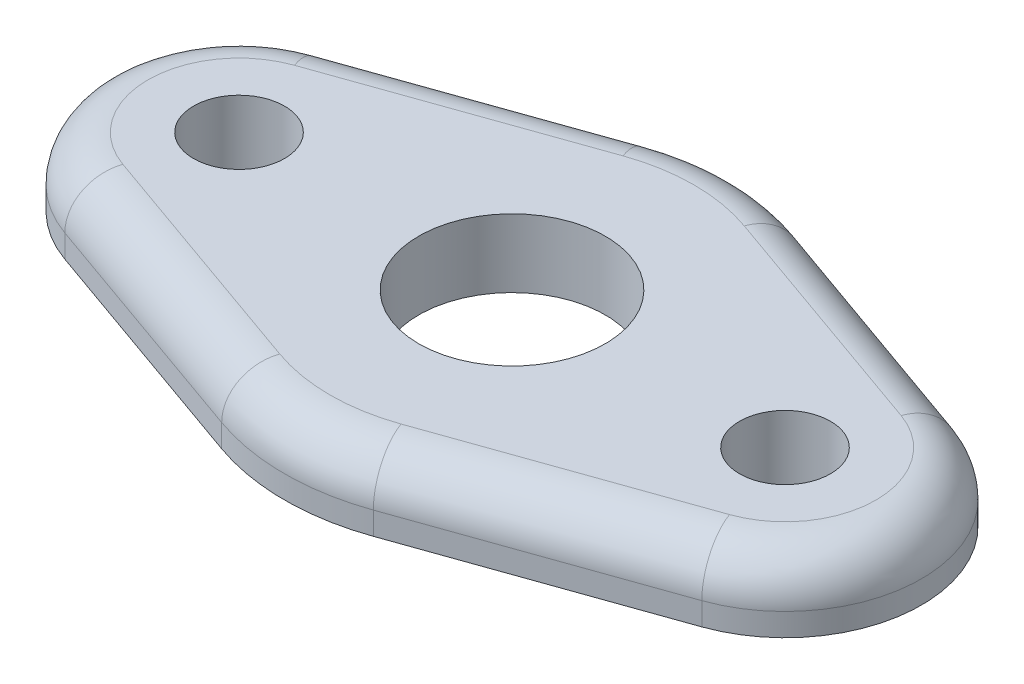
ISO-10303-21;
HEADER;
FILE_DESCRIPTION(('STEP AP214'),'2;1');
FILE_NAME('part.step','',(''),(''),'','','');
FILE_SCHEMA(('AUTOMOTIVE_DESIGN { 1 0 10303 214 1 1 1 1 }'));
ENDSEC;
DATA;
#1=APPLICATION_CONTEXT('core data for automotive mechanical design processes');
#2=APPLICATION_PROTOCOL_DEFINITION('international standard','automotive_design',2000,#1);
#3=PRODUCT_CONTEXT('',#1,'mechanical');
#4=PRODUCT('Part','Part','',(#3));
#5=PRODUCT_RELATED_PRODUCT_CATEGORY('part','',(#4));
#6=PRODUCT_DEFINITION_FORMATION('','',#4);
#7=PRODUCT_DEFINITION_CONTEXT('part definition',#1,'design');
#8=PRODUCT_DEFINITION('design','',#6,#7);
#9=PRODUCT_DEFINITION_SHAPE('','',#8);
#10=(LENGTH_UNIT() NAMED_UNIT(*) SI_UNIT(.MILLI.,.METRE.));
#11=(NAMED_UNIT(*) PLANE_ANGLE_UNIT() SI_UNIT($,.RADIAN.));
#12=(NAMED_UNIT(*) SI_UNIT($,.STERADIAN.) SOLID_ANGLE_UNIT());
#13=UNCERTAINTY_MEASURE_WITH_UNIT(LENGTH_MEASURE(1.E-05),#10,'distance_accuracy_value','');
#14=(GEOMETRIC_REPRESENTATION_CONTEXT(3) GLOBAL_UNCERTAINTY_ASSIGNED_CONTEXT((#13)) GLOBAL_UNIT_ASSIGNED_CONTEXT((#10,
#11,#12)) REPRESENTATION_CONTEXT('',''));
#15=CARTESIAN_POINT('',(0.,0.,0.));
#16=DIRECTION('',(0.,0.,1.));
#17=DIRECTION('',(1.,0.,0.));
#18=AXIS2_PLACEMENT_3D('',#15,#16,#17);
#19=CARTESIAN_POINT('',(-12.,3.,0.));
#20=DIRECTION('',(0.,1.,0.));
#21=DIRECTION('',(0.,0.,1.));
#22=AXIS2_PLACEMENT_3D('',#19,#20,#21);
#23=PLANE('',#22);
#24=DIRECTION('',(0.942809041582064,0.,0.333333333333333));
#25=VECTOR('',#24,1.);
#26=CARTESIAN_POINT('',(-2.66666666666666,3.,7.54247233265651));
#27=LINE('',#26,#25);
#28=CARTESIAN_POINT('',(-13.3333333333333,3.,3.77123616632826));
#29=VERTEX_POINT('',#28);
#30=CARTESIAN_POINT('',(-2.66666666666667,3.,7.54247233265651));
#31=VERTEX_POINT('',#30);
#32=EDGE_CURVE('E196',#29,#31,#27,.T.);
#33=ORIENTED_EDGE('',*,*,#32,.T.);
#34=CARTESIAN_POINT('',(0.,3.,0.));
#35=DIRECTION('',(0.,1.,0.));
#36=DIRECTION('',(0.,0.,1.));
#37=AXIS2_PLACEMENT_3D('',#34,#35,#36);
#38=CIRCLE('',#37,8.);
#39=CARTESIAN_POINT('',(2.66666666666667,3.,7.54247233265651));
#40=VERTEX_POINT('',#39);
#41=EDGE_CURVE('E198',#31,#40,#38,.T.);
#42=ORIENTED_EDGE('',*,*,#41,.T.);
#43=DIRECTION('',(0.942809041582063,0.,-0.333333333333333));
#44=VECTOR('',#43,1.);
#45=CARTESIAN_POINT('',(13.3333333333333,3.,3.77123616632826));
#46=LINE('',#45,#44);
#47=CARTESIAN_POINT('',(13.3333333333333,3.,3.77123616632826));
#48=VERTEX_POINT('',#47);
#49=EDGE_CURVE('E134',#40,#48,#46,.T.);
#50=ORIENTED_EDGE('',*,*,#49,.T.);
#51=CARTESIAN_POINT('',(12.,3.,0.));
#52=DIRECTION('',(0.,1.,0.));
#53=DIRECTION('',(0.,0.,1.));
#54=AXIS2_PLACEMENT_3D('',#51,#52,#53);
#55=CIRCLE('',#54,4.);
#56=CARTESIAN_POINT('',(13.3333333333333,3.,-3.77123616632826));
#57=VERTEX_POINT('',#56);
#58=EDGE_CURVE('E186',#48,#57,#55,.T.);
#59=ORIENTED_EDGE('',*,*,#58,.T.);
#60=DIRECTION('',(-0.942809041582063,0.,-0.333333333333333));
#61=VECTOR('',#60,1.);
#62=CARTESIAN_POINT('',(2.66666666666666,3.,-7.54247233265651));
#63=LINE('',#62,#61);
#64=CARTESIAN_POINT('',(2.66666666666666,3.,-7.54247233265651));
#65=VERTEX_POINT('',#64);
#66=EDGE_CURVE('E188',#57,#65,#63,.T.);
#67=ORIENTED_EDGE('',*,*,#66,.T.);
#68=CARTESIAN_POINT('',(0.,3.,0.));
#69=DIRECTION('',(0.,1.,0.));
#70=DIRECTION('',(0.,0.,1.));
#71=AXIS2_PLACEMENT_3D('',#68,#69,#70);
#72=CIRCLE('',#71,8.);
#73=CARTESIAN_POINT('',(-2.66666666666667,3.,-7.54247233265651));
#74=VERTEX_POINT('',#73);
#75=EDGE_CURVE('E190',#65,#74,#72,.T.);
#76=ORIENTED_EDGE('',*,*,#75,.T.);
#77=DIRECTION('',(-0.942809041582064,0.,0.333333333333333));
#78=VECTOR('',#77,1.);
#79=CARTESIAN_POINT('',(-13.3333333333333,3.,-3.77123616632826));
#80=LINE('',#79,#78);
#81=CARTESIAN_POINT('',(-13.3333333333333,3.,-3.77123616632826));
#82=VERTEX_POINT('',#81);
#83=EDGE_CURVE('E192',#74,#82,#80,.T.);
#84=ORIENTED_EDGE('',*,*,#83,.T.);
#85=CARTESIAN_POINT('',(-12.,3.,0.));
#86=DIRECTION('',(0.,1.,0.));
#87=DIRECTION('',(0.,0.,1.));
#88=AXIS2_PLACEMENT_3D('',#85,#86,#87);
#89=CIRCLE('',#88,4.);
#90=EDGE_CURVE('E194',#82,#29,#89,.T.);
#91=ORIENTED_EDGE('',*,*,#90,.T.);
#92=EDGE_LOOP('',(#33,#42,#50,#59,#67,#76,#84,#91));
#93=FACE_BOUND('',#92,.T.);
#94=CARTESIAN_POINT('',(-12.,3.,0.));
#95=DIRECTION('',(0.,1.,0.));
#96=DIRECTION('',(0.,0.,1.));
#97=AXIS2_PLACEMENT_3D('',#94,#95,#96);
#98=CIRCLE('',#97,2.);
#99=CARTESIAN_POINT('',(-12.,3.,2.));
#100=VERTEX_POINT('',#99);
#101=EDGE_CURVE('E248',#100,#100,#98,.T.);
#102=ORIENTED_EDGE('',*,*,#101,.F.);
#103=EDGE_LOOP('',(#102));
#104=FACE_BOUND('',#103,.T.);
#105=CARTESIAN_POINT('',(0.,3.,0.));
#106=DIRECTION('',(0.,1.,0.));
#107=DIRECTION('',(0.,0.,1.));
#108=AXIS2_PLACEMENT_3D('',#105,#106,#107);
#109=CIRCLE('',#108,4.1);
#110=CARTESIAN_POINT('',(0.,3.,4.1));
#111=VERTEX_POINT('',#110);
#112=EDGE_CURVE('E151',#111,#111,#109,.T.);
#113=ORIENTED_EDGE('',*,*,#112,.F.);
#114=EDGE_LOOP('',(#113));
#115=FACE_BOUND('',#114,.T.);
#116=CARTESIAN_POINT('',(12.,3.,0.));
#117=DIRECTION('',(0.,1.,0.));
#118=DIRECTION('',(0.,0.,1.));
#119=AXIS2_PLACEMENT_3D('',#116,#117,#118);
#120=CIRCLE('',#119,2.);
#121=CARTESIAN_POINT('',(12.,3.,2.));
#122=VERTEX_POINT('',#121);
#123=EDGE_CURVE('E240',#122,#122,#120,.T.);
#124=ORIENTED_EDGE('',*,*,#123,.F.);
#125=EDGE_LOOP('',(#124));
#126=FACE_BOUND('',#125,.T.);
#127=ADVANCED_FACE('F33',(#93,#104,#115,#126),#23,.T.);
#128=CARTESIAN_POINT('',(-12.,0.,0.));
#129=DIRECTION('',(0.,1.,0.));
#130=DIRECTION('',(0.,0.,1.));
#131=AXIS2_PLACEMENT_3D('',#128,#129,#130);
#132=PLANE('',#131);
#133=CARTESIAN_POINT('',(-12.,0.,0.));
#134=DIRECTION('',(0.,1.,0.));
#135=DIRECTION('',(0.,0.,1.));
#136=AXIS2_PLACEMENT_3D('',#133,#134,#135);
#137=CIRCLE('',#136,6.);
#138=CARTESIAN_POINT('',(-14.,0.,-5.65685424949238));
#139=VERTEX_POINT('',#138);
#140=CARTESIAN_POINT('',(-14.,0.,5.65685424949238));
#141=VERTEX_POINT('',#140);
#142=EDGE_CURVE('E142',#139,#141,#137,.T.);
#143=ORIENTED_EDGE('',*,*,#142,.F.);
#144=DIRECTION('',(-0.942809041582064,0.,0.333333333333333));
#145=VECTOR('',#144,1.);
#146=CARTESIAN_POINT('',(-14.,0.,-5.65685424949238));
#147=LINE('',#146,#145);
#148=CARTESIAN_POINT('',(-3.33333333333333,0.,-9.42809041582063));
#149=VERTEX_POINT('',#148);
#150=EDGE_CURVE('E171',#149,#139,#147,.T.);
#151=ORIENTED_EDGE('',*,*,#150,.F.);
#152=CARTESIAN_POINT('',(0.,0.,0.));
#153=DIRECTION('',(0.,1.,0.));
#154=DIRECTION('',(0.,0.,1.));
#155=AXIS2_PLACEMENT_3D('',#152,#153,#154);
#156=CIRCLE('',#155,10.);
#157=CARTESIAN_POINT('',(3.33333333333333,0.,-9.42809041582064));
#158=VERTEX_POINT('',#157);
#159=EDGE_CURVE('E168',#158,#149,#156,.T.);
#160=ORIENTED_EDGE('',*,*,#159,.F.);
#161=DIRECTION('',(-0.942809041582063,0.,-0.333333333333333));
#162=VECTOR('',#161,1.);
#163=CARTESIAN_POINT('',(3.33333333333333,0.,-9.42809041582064));
#164=LINE('',#163,#162);
#165=CARTESIAN_POINT('',(14.,0.,-5.65685424949238));
#166=VERTEX_POINT('',#165);
#167=EDGE_CURVE('E165',#166,#158,#164,.T.);
#168=ORIENTED_EDGE('',*,*,#167,.F.);
#169=CARTESIAN_POINT('',(12.,0.,0.));
#170=DIRECTION('',(0.,1.,0.));
#171=DIRECTION('',(0.,0.,1.));
#172=AXIS2_PLACEMENT_3D('',#169,#170,#171);
#173=CIRCLE('',#172,6.);
#174=CARTESIAN_POINT('',(14.,0.,5.65685424949238));
#175=VERTEX_POINT('',#174);
#176=EDGE_CURVE('E162',#175,#166,#173,.T.);
#177=ORIENTED_EDGE('',*,*,#176,.F.);
#178=DIRECTION('',(0.942809041582063,0.,-0.333333333333333));
#179=VECTOR('',#178,1.);
#180=CARTESIAN_POINT('',(3.33333333333333,0.,9.42809041582064));
#181=LINE('',#180,#179);
#182=CARTESIAN_POINT('',(3.33333333333333,0.,9.42809041582064));
#183=VERTEX_POINT('',#182);
#184=EDGE_CURVE('E159',#183,#175,#181,.T.);
#185=ORIENTED_EDGE('',*,*,#184,.F.);
#186=CARTESIAN_POINT('',(0.,0.,0.));
#187=DIRECTION('',(0.,1.,0.));
#188=DIRECTION('',(0.,0.,1.));
#189=AXIS2_PLACEMENT_3D('',#186,#187,#188);
#190=CIRCLE('',#189,10.);
#191=CARTESIAN_POINT('',(-3.33333333333333,0.,9.42809041582063));
#192=VERTEX_POINT('',#191);
#193=EDGE_CURVE('E145',#192,#183,#190,.T.);
#194=ORIENTED_EDGE('',*,*,#193,.F.);
#195=DIRECTION('',(0.942809041582064,0.,0.333333333333333));
#196=VECTOR('',#195,1.);
#197=CARTESIAN_POINT('',(-14.,0.,5.65685424949238));
#198=LINE('',#197,#196);
#199=EDGE_CURVE('E127',#141,#192,#198,.T.);
#200=ORIENTED_EDGE('',*,*,#199,.F.);
#201=EDGE_LOOP('',(#143,#151,#160,#168,#177,#185,#194,#200));
#202=FACE_BOUND('',#201,.T.);
#203=CARTESIAN_POINT('',(0.,0.,0.));
#204=DIRECTION('',(0.,1.,0.));
#205=DIRECTION('',(0.,0.,1.));
#206=AXIS2_PLACEMENT_3D('',#203,#204,#205);
#207=CIRCLE('',#206,4.1);
#208=CARTESIAN_POINT('',(0.,0.,4.1));
#209=VERTEX_POINT('',#208);
#210=EDGE_CURVE('E154',#209,#209,#207,.T.);
#211=ORIENTED_EDGE('',*,*,#210,.T.);
#212=EDGE_LOOP('',(#211));
#213=FACE_BOUND('',#212,.T.);
#214=CARTESIAN_POINT('',(-12.,0.,0.));
#215=DIRECTION('',(0.,1.,0.));
#216=DIRECTION('',(0.,0.,1.));
#217=AXIS2_PLACEMENT_3D('',#214,#215,#216);
#218=CIRCLE('',#217,2.);
#219=CARTESIAN_POINT('',(-12.,0.,2.));
#220=VERTEX_POINT('',#219);
#221=EDGE_CURVE('E245',#220,#220,#218,.T.);
#222=ORIENTED_EDGE('',*,*,#221,.T.);
#223=EDGE_LOOP('',(#222));
#224=FACE_BOUND('',#223,.T.);
#225=CARTESIAN_POINT('',(12.,0.,0.));
#226=DIRECTION('',(0.,1.,0.));
#227=DIRECTION('',(0.,0.,1.));
#228=AXIS2_PLACEMENT_3D('',#225,#226,#227);
#229=CIRCLE('',#228,2.);
#230=CARTESIAN_POINT('',(12.,0.,2.));
#231=VERTEX_POINT('',#230);
#232=EDGE_CURVE('E234',#231,#231,#229,.T.);
#233=ORIENTED_EDGE('',*,*,#232,.T.);
#234=EDGE_LOOP('',(#233));
#235=FACE_BOUND('',#234,.T.);
#236=ADVANCED_FACE('F139',(#202,#213,#224,#235),#132,.F.);
#237=CARTESIAN_POINT('',(-12.,3.,0.));
#238=DIRECTION('',(0.,-1.,0.));
#239=DIRECTION('',(0.,0.,-1.));
#240=AXIS2_PLACEMENT_3D('',#237,#238,#239);
#241=CYLINDRICAL_SURFACE('',#240,6.);
#242=DIRECTION('',(0.,-1.,0.));
#243=VECTOR('',#242,1.);
#244=CARTESIAN_POINT('',(-14.,3.,5.65685424949238));
#245=LINE('',#244,#243);
#246=CARTESIAN_POINT('',(-14.,1.,5.65685424949238));
#247=VERTEX_POINT('',#246);
#248=EDGE_CURVE('E123',#247,#141,#245,.T.);
#249=ORIENTED_EDGE('',*,*,#248,.F.);
#250=CARTESIAN_POINT('',(-12.,1.,0.));
#251=DIRECTION('',(0.,1.,0.));
#252=DIRECTION('',(0.,0.,1.));
#253=AXIS2_PLACEMENT_3D('',#250,#251,#252);
#254=CIRCLE('',#253,6.);
#255=CARTESIAN_POINT('',(-14.,1.,-5.65685424949238));
#256=VERTEX_POINT('',#255);
#257=EDGE_CURVE('E205',#247,#256,#254,.F.);
#258=ORIENTED_EDGE('',*,*,#257,.T.);
#259=DIRECTION('',(0.,-1.,0.));
#260=VECTOR('',#259,1.);
#261=CARTESIAN_POINT('',(-14.,3.,-5.65685424949238));
#262=LINE('',#261,#260);
#263=EDGE_CURVE('E149',#256,#139,#262,.T.);
#264=ORIENTED_EDGE('',*,*,#263,.T.);
#265=ORIENTED_EDGE('',*,*,#142,.T.);
#266=EDGE_LOOP('',(#249,#258,#264,#265));
#267=FACE_BOUND('',#266,.T.);
#268=ADVANCED_FACE('F147',(#267),#241,.T.);
#269=CARTESIAN_POINT('',(-14.,3.,5.65685424949238));
#270=DIRECTION('',(0.333333333333333,0.,-0.942809041582063));
#271=DIRECTION('',(-0.942809041582064,0.,-0.333333333333333));
#272=AXIS2_PLACEMENT_3D('',#269,#270,#271);
#273=PLANE('',#272);
#274=DIRECTION('',(0.,-1.,0.));
#275=VECTOR('',#274,1.);
#276=CARTESIAN_POINT('',(-3.33333333333333,3.,9.42809041582063));
#277=LINE('',#276,#275);
#278=CARTESIAN_POINT('',(-3.33333333333333,1.,9.42809041582063));
#279=VERTEX_POINT('',#278);
#280=EDGE_CURVE('E135',#279,#192,#277,.T.);
#281=ORIENTED_EDGE('',*,*,#280,.F.);
#282=DIRECTION('',(0.942809041582064,0.,0.333333333333333));
#283=VECTOR('',#282,1.);
#284=CARTESIAN_POINT('',(-14.,1.,5.65685424949238));
#285=LINE('',#284,#283);
#286=EDGE_CURVE('E130',#279,#247,#285,.F.);
#287=ORIENTED_EDGE('',*,*,#286,.T.);
#288=ORIENTED_EDGE('',*,*,#248,.T.);
#289=ORIENTED_EDGE('',*,*,#199,.T.);
#290=EDGE_LOOP('',(#281,#287,#288,#289));
#291=FACE_BOUND('',#290,.T.);
#292=ADVANCED_FACE('F126',(#291),#273,.F.);
#293=CARTESIAN_POINT('',(0.,3.,0.));
#294=DIRECTION('',(0.,-1.,0.));
#295=DIRECTION('',(0.,0.,-1.));
#296=AXIS2_PLACEMENT_3D('',#293,#294,#295);
#297=CYLINDRICAL_SURFACE('',#296,10.);
#298=DIRECTION('',(0.,-1.,0.));
#299=VECTOR('',#298,1.);
#300=CARTESIAN_POINT('',(3.33333333333333,3.,9.42809041582064));
#301=LINE('',#300,#299);
#302=CARTESIAN_POINT('',(3.33333333333333,1.,9.42809041582064));
#303=VERTEX_POINT('',#302);
#304=EDGE_CURVE('E182',#303,#183,#301,.T.);
#305=ORIENTED_EDGE('',*,*,#304,.F.);
#306=CARTESIAN_POINT('',(0.,1.,0.));
#307=DIRECTION('',(0.,1.,0.));
#308=DIRECTION('',(0.,0.,1.));
#309=AXIS2_PLACEMENT_3D('',#306,#307,#308);
#310=CIRCLE('',#309,10.);
#311=EDGE_CURVE('E201',#303,#279,#310,.F.);
#312=ORIENTED_EDGE('',*,*,#311,.T.);
#313=ORIENTED_EDGE('',*,*,#280,.T.);
#314=ORIENTED_EDGE('',*,*,#193,.T.);
#315=EDGE_LOOP('',(#305,#312,#313,#314));
#316=FACE_BOUND('',#315,.T.);
#317=ADVANCED_FACE('F295',(#316),#297,.T.);
#318=CARTESIAN_POINT('',(3.33333333333333,3.,9.42809041582064));
#319=DIRECTION('',(-0.333333333333333,0.,-0.942809041582063));
#320=DIRECTION('',(-0.942809041582063,0.,0.333333333333333));
#321=AXIS2_PLACEMENT_3D('',#318,#319,#320);
#322=PLANE('',#321);
#323=DIRECTION('',(0.,-1.,0.));
#324=VECTOR('',#323,1.);
#325=CARTESIAN_POINT('',(14.,3.,5.65685424949238));
#326=LINE('',#325,#324);
#327=CARTESIAN_POINT('',(14.,1.,5.65685424949238));
#328=VERTEX_POINT('',#327);
#329=EDGE_CURVE('E180',#328,#175,#326,.T.);
#330=ORIENTED_EDGE('',*,*,#329,.F.);
#331=DIRECTION('',(0.942809041582063,0.,-0.333333333333333));
#332=VECTOR('',#331,1.);
#333=CARTESIAN_POINT('',(3.33333333333333,1.,9.42809041582064));
#334=LINE('',#333,#332);
#335=EDGE_CURVE('E11',#328,#303,#334,.F.);
#336=ORIENTED_EDGE('',*,*,#335,.T.);
#337=ORIENTED_EDGE('',*,*,#304,.T.);
#338=ORIENTED_EDGE('',*,*,#184,.T.);
#339=EDGE_LOOP('',(#330,#336,#337,#338));
#340=FACE_BOUND('',#339,.T.);
#341=ADVANCED_FACE('F292',(#340),#322,.F.);
#342=CARTESIAN_POINT('',(12.,3.,0.));
#343=DIRECTION('',(0.,-1.,0.));
#344=DIRECTION('',(0.,0.,-1.));
#345=AXIS2_PLACEMENT_3D('',#342,#343,#344);
#346=CYLINDRICAL_SURFACE('',#345,6.);
#347=DIRECTION('',(0.,-1.,0.));
#348=VECTOR('',#347,1.);
#349=CARTESIAN_POINT('',(14.,3.,-5.65685424949238));
#350=LINE('',#349,#348);
#351=CARTESIAN_POINT('',(14.,1.,-5.65685424949238));
#352=VERTEX_POINT('',#351);
#353=EDGE_CURVE('E178',#352,#166,#350,.T.);
#354=ORIENTED_EDGE('',*,*,#353,.F.);
#355=CARTESIAN_POINT('',(12.,1.,0.));
#356=DIRECTION('',(0.,1.,0.));
#357=DIRECTION('',(0.,0.,1.));
#358=AXIS2_PLACEMENT_3D('',#355,#356,#357);
#359=CIRCLE('',#358,6.);
#360=EDGE_CURVE('E42',#352,#328,#359,.F.);
#361=ORIENTED_EDGE('',*,*,#360,.T.);
#362=ORIENTED_EDGE('',*,*,#329,.T.);
#363=ORIENTED_EDGE('',*,*,#176,.T.);
#364=EDGE_LOOP('',(#354,#361,#362,#363));
#365=FACE_BOUND('',#364,.T.);
#366=ADVANCED_FACE('F289',(#365),#346,.T.);
#367=CARTESIAN_POINT('',(3.33333333333333,3.,-9.42809041582064));
#368=DIRECTION('',(-0.333333333333333,0.,0.942809041582063));
#369=DIRECTION('',(0.942809041582063,0.,0.333333333333333));
#370=AXIS2_PLACEMENT_3D('',#367,#368,#369);
#371=PLANE('',#370);
#372=DIRECTION('',(0.,-1.,0.));
#373=VECTOR('',#372,1.);
#374=CARTESIAN_POINT('',(3.33333333333333,3.,-9.42809041582064));
#375=LINE('',#374,#373);
#376=CARTESIAN_POINT('',(3.33333333333333,1.,-9.42809041582064));
#377=VERTEX_POINT('',#376);
#378=EDGE_CURVE('E176',#377,#158,#375,.T.);
#379=ORIENTED_EDGE('',*,*,#378,.F.);
#380=DIRECTION('',(-0.942809041582063,0.,-0.333333333333333));
#381=VECTOR('',#380,1.);
#382=CARTESIAN_POINT('',(14.,1.,-5.65685424949238));
#383=LINE('',#382,#381);
#384=EDGE_CURVE('E57',#377,#352,#383,.F.);
#385=ORIENTED_EDGE('',*,*,#384,.T.);
#386=ORIENTED_EDGE('',*,*,#353,.T.);
#387=ORIENTED_EDGE('',*,*,#167,.T.);
#388=EDGE_LOOP('',(#379,#385,#386,#387));
#389=FACE_BOUND('',#388,.T.);
#390=ADVANCED_FACE('F285',(#389),#371,.F.);
#391=CARTESIAN_POINT('',(0.,3.,0.));
#392=DIRECTION('',(0.,-1.,0.));
#393=DIRECTION('',(0.,0.,-1.));
#394=AXIS2_PLACEMENT_3D('',#391,#392,#393);
#395=CYLINDRICAL_SURFACE('',#394,10.);
#396=DIRECTION('',(0.,-1.,0.));
#397=VECTOR('',#396,1.);
#398=CARTESIAN_POINT('',(-3.33333333333333,3.,-9.42809041582063));
#399=LINE('',#398,#397);
#400=CARTESIAN_POINT('',(-3.33333333333333,1.,-9.42809041582063));
#401=VERTEX_POINT('',#400);
#402=EDGE_CURVE('E174',#401,#149,#399,.T.);
#403=ORIENTED_EDGE('',*,*,#402,.F.);
#404=CARTESIAN_POINT('',(0.,1.,0.));
#405=DIRECTION('',(0.,1.,0.));
#406=DIRECTION('',(0.,0.,1.));
#407=AXIS2_PLACEMENT_3D('',#404,#405,#406);
#408=CIRCLE('',#407,10.);
#409=EDGE_CURVE('E209',#401,#377,#408,.F.);
#410=ORIENTED_EDGE('',*,*,#409,.T.);
#411=ORIENTED_EDGE('',*,*,#378,.T.);
#412=ORIENTED_EDGE('',*,*,#159,.T.);
#413=EDGE_LOOP('',(#403,#410,#411,#412));
#414=FACE_BOUND('',#413,.T.);
#415=ADVANCED_FACE('F281',(#414),#395,.T.);
#416=CARTESIAN_POINT('',(-14.,3.,-5.65685424949238));
#417=DIRECTION('',(0.333333333333333,0.,0.942809041582063));
#418=DIRECTION('',(0.942809041582064,0.,-0.333333333333333));
#419=AXIS2_PLACEMENT_3D('',#416,#417,#418);
#420=PLANE('',#419);
#421=ORIENTED_EDGE('',*,*,#263,.F.);
#422=DIRECTION('',(-0.942809041582064,0.,0.333333333333333));
#423=VECTOR('',#422,1.);
#424=CARTESIAN_POINT('',(-3.33333333333333,1.,-9.42809041582064));
#425=LINE('',#424,#423);
#426=EDGE_CURVE('E207',#256,#401,#425,.F.);
#427=ORIENTED_EDGE('',*,*,#426,.T.);
#428=ORIENTED_EDGE('',*,*,#402,.T.);
#429=ORIENTED_EDGE('',*,*,#150,.T.);
#430=EDGE_LOOP('',(#421,#427,#428,#429));
#431=FACE_BOUND('',#430,.T.);
#432=ADVANCED_FACE('F267',(#431),#420,.F.);
#433=CARTESIAN_POINT('',(0.,3.,0.));
#434=DIRECTION('',(0.,-1.,0.));
#435=DIRECTION('',(0.,0.,-1.));
#436=AXIS2_PLACEMENT_3D('',#433,#434,#435);
#437=CYLINDRICAL_SURFACE('',#436,4.1);
#438=ORIENTED_EDGE('',*,*,#112,.T.);
#439=EDGE_LOOP('',(#438));
#440=FACE_BOUND('',#439,.T.);
#441=ORIENTED_EDGE('',*,*,#210,.F.);
#442=EDGE_LOOP('',(#441));
#443=FACE_BOUND('',#442,.T.);
#444=ADVANCED_FACE('F258',(#440,#443),#437,.F.);
#445=CARTESIAN_POINT('',(-12.,3.,0.));
#446=DIRECTION('',(0.,-1.,0.));
#447=DIRECTION('',(0.,0.,-1.));
#448=AXIS2_PLACEMENT_3D('',#445,#446,#447);
#449=CYLINDRICAL_SURFACE('',#448,2.);
#450=ORIENTED_EDGE('',*,*,#101,.T.);
#451=EDGE_LOOP('',(#450));
#452=FACE_BOUND('',#451,.T.);
#453=ORIENTED_EDGE('',*,*,#221,.F.);
#454=EDGE_LOOP('',(#453));
#455=FACE_BOUND('',#454,.T.);
#456=ADVANCED_FACE('F255',(#452,#455),#449,.F.);
#457=CARTESIAN_POINT('',(12.,3.,0.));
#458=DIRECTION('',(0.,-1.,0.));
#459=DIRECTION('',(0.,0.,-1.));
#460=AXIS2_PLACEMENT_3D('',#457,#458,#459);
#461=CYLINDRICAL_SURFACE('',#460,2.);
#462=ORIENTED_EDGE('',*,*,#123,.T.);
#463=EDGE_LOOP('',(#462));
#464=FACE_BOUND('',#463,.T.);
#465=ORIENTED_EDGE('',*,*,#232,.F.);
#466=EDGE_LOOP('',(#465));
#467=FACE_BOUND('',#466,.T.);
#468=ADVANCED_FACE('F257',(#464,#467),#461,.F.);
#469=CARTESIAN_POINT('',(0.,1.,0.));
#470=DIRECTION('',(0.,1.,0.));
#471=DIRECTION('',(0.,0.,1.));
#472=AXIS2_PLACEMENT_3D('',#469,#470,#471);
#473=TOROIDAL_SURFACE('',#472,8.,2.);
#474=CARTESIAN_POINT('',(2.66666666666666,1.,-7.54247233265651));
#475=DIRECTION('',(0.942809041582063,0.,0.333333333333333));
#476=DIRECTION('',(0.333333333333333,0.,-0.942809041582063));
#477=AXIS2_PLACEMENT_3D('',#474,#475,#476);
#478=CIRCLE('',#477,2.);
#479=EDGE_CURVE('E228',#377,#65,#478,.T.);
#480=ORIENTED_EDGE('',*,*,#479,.F.);
#481=ORIENTED_EDGE('',*,*,#409,.F.);
#482=CARTESIAN_POINT('',(-2.66666666666667,1.,-7.54247233265651));
#483=DIRECTION('',(-0.942809041582063,0.,0.333333333333333));
#484=DIRECTION('',(0.333333333333333,0.,0.942809041582063));
#485=AXIS2_PLACEMENT_3D('',#482,#483,#484);
#486=CIRCLE('',#485,2.);
#487=EDGE_CURVE('E37',#74,#401,#486,.T.);
#488=ORIENTED_EDGE('',*,*,#487,.F.);
#489=ORIENTED_EDGE('',*,*,#75,.F.);
#490=EDGE_LOOP('',(#480,#481,#488,#489));
#491=FACE_BOUND('',#490,.T.);
#492=ADVANCED_FACE('F35',(#491),#473,.T.);
#493=CARTESIAN_POINT('',(-13.3333333333333,1.,-3.77123616632826));
#494=DIRECTION('',(0.942809041582064,0.,-0.333333333333333));
#495=DIRECTION('',(-0.333333333333333,0.,-0.942809041582063));
#496=AXIS2_PLACEMENT_3D('',#493,#494,#495);
#497=CYLINDRICAL_SURFACE('',#496,2.);
#498=ORIENTED_EDGE('',*,*,#487,.T.);
#499=ORIENTED_EDGE('',*,*,#426,.F.);
#500=CARTESIAN_POINT('',(-13.3333333333333,1.,-3.77123616632826));
#501=DIRECTION('',(-0.942809041582063,0.,0.333333333333333));
#502=DIRECTION('',(0.333333333333333,0.,0.942809041582064));
#503=AXIS2_PLACEMENT_3D('',#500,#501,#502);
#504=CIRCLE('',#503,2.);
#505=EDGE_CURVE('E226',#82,#256,#504,.T.);
#506=ORIENTED_EDGE('',*,*,#505,.F.);
#507=ORIENTED_EDGE('',*,*,#83,.F.);
#508=EDGE_LOOP('',(#498,#499,#506,#507));
#509=FACE_BOUND('',#508,.T.);
#510=ADVANCED_FACE('F326',(#509),#497,.T.);
#511=CARTESIAN_POINT('',(-8.,1.,-11.3137084989848));
#512=DIRECTION('',(0.942809041582063,0.,0.333333333333333));
#513=DIRECTION('',(0.333333333333333,0.,-0.942809041582063));
#514=AXIS2_PLACEMENT_3D('',#511,#512,#513);
#515=CYLINDRICAL_SURFACE('',#514,2.);
#516=ORIENTED_EDGE('',*,*,#479,.T.);
#517=ORIENTED_EDGE('',*,*,#66,.F.);
#518=CARTESIAN_POINT('',(13.3333333333333,1.,-3.77123616632826));
#519=DIRECTION('',(0.942809041582063,0.,0.333333333333333));
#520=DIRECTION('',(0.333333333333333,0.,-0.942809041582063));
#521=AXIS2_PLACEMENT_3D('',#518,#519,#520);
#522=CIRCLE('',#521,2.);
#523=EDGE_CURVE('E223',#352,#57,#522,.T.);
#524=ORIENTED_EDGE('',*,*,#523,.F.);
#525=ORIENTED_EDGE('',*,*,#384,.F.);
#526=EDGE_LOOP('',(#516,#517,#524,#525));
#527=FACE_BOUND('',#526,.T.);
#528=ADVANCED_FACE('F323',(#527),#515,.T.);
#529=CARTESIAN_POINT('',(-12.,1.,0.));
#530=DIRECTION('',(0.,1.,0.));
#531=DIRECTION('',(0.,0.,1.));
#532=AXIS2_PLACEMENT_3D('',#529,#530,#531);
#533=TOROIDAL_SURFACE('',#532,4.,2.);
#534=ORIENTED_EDGE('',*,*,#505,.T.);
#535=ORIENTED_EDGE('',*,*,#257,.F.);
#536=CARTESIAN_POINT('',(-13.3333333333333,1.,3.77123616632826));
#537=DIRECTION('',(0.942809041582063,0.,0.333333333333333));
#538=DIRECTION('',(0.333333333333333,0.,-0.942809041582064));
#539=AXIS2_PLACEMENT_3D('',#536,#537,#538);
#540=CIRCLE('',#539,2.);
#541=EDGE_CURVE('E220',#29,#247,#540,.T.);
#542=ORIENTED_EDGE('',*,*,#541,.F.);
#543=ORIENTED_EDGE('',*,*,#90,.F.);
#544=EDGE_LOOP('',(#534,#535,#542,#543));
#545=FACE_BOUND('',#544,.T.);
#546=ADVANCED_FACE('F319',(#545),#533,.T.);
#547=CARTESIAN_POINT('',(12.,1.,0.));
#548=DIRECTION('',(0.,1.,0.));
#549=DIRECTION('',(0.,0.,1.));
#550=AXIS2_PLACEMENT_3D('',#547,#548,#549);
#551=TOROIDAL_SURFACE('',#550,4.,2.);
#552=ORIENTED_EDGE('',*,*,#523,.T.);
#553=ORIENTED_EDGE('',*,*,#58,.F.);
#554=CARTESIAN_POINT('',(13.3333333333333,1.,3.77123616632826));
#555=DIRECTION('',(-0.942809041582063,0.,0.333333333333333));
#556=DIRECTION('',(0.333333333333333,0.,0.942809041582063));
#557=AXIS2_PLACEMENT_3D('',#554,#555,#556);
#558=CIRCLE('',#557,2.);
#559=EDGE_CURVE('E217',#328,#48,#558,.T.);
#560=ORIENTED_EDGE('',*,*,#559,.F.);
#561=ORIENTED_EDGE('',*,*,#360,.F.);
#562=EDGE_LOOP('',(#552,#553,#560,#561));
#563=FACE_BOUND('',#562,.T.);
#564=ADVANCED_FACE('F315',(#563),#551,.T.);
#565=CARTESIAN_POINT('',(-13.3333333333333,1.,3.77123616632826));
#566=DIRECTION('',(-0.942809041582064,0.,-0.333333333333333));
#567=DIRECTION('',(-0.333333333333333,0.,0.942809041582063));
#568=AXIS2_PLACEMENT_3D('',#565,#566,#567);
#569=CYLINDRICAL_SURFACE('',#568,2.);
#570=ORIENTED_EDGE('',*,*,#541,.T.);
#571=ORIENTED_EDGE('',*,*,#286,.F.);
#572=CARTESIAN_POINT('',(-2.66666666666667,1.,7.54247233265651));
#573=DIRECTION('',(0.942809041582063,0.,0.333333333333333));
#574=DIRECTION('',(0.333333333333333,0.,-0.942809041582063));
#575=AXIS2_PLACEMENT_3D('',#572,#573,#574);
#576=CIRCLE('',#575,2.);
#577=EDGE_CURVE('E215',#31,#279,#576,.T.);
#578=ORIENTED_EDGE('',*,*,#577,.F.);
#579=ORIENTED_EDGE('',*,*,#32,.F.);
#580=EDGE_LOOP('',(#570,#571,#578,#579));
#581=FACE_BOUND('',#580,.T.);
#582=ADVANCED_FACE('F311',(#581),#569,.T.);
#583=CARTESIAN_POINT('',(-8.,1.,11.3137084989848));
#584=DIRECTION('',(-0.942809041582063,0.,0.333333333333333));
#585=DIRECTION('',(0.333333333333333,0.,0.942809041582063));
#586=AXIS2_PLACEMENT_3D('',#583,#584,#585);
#587=CYLINDRICAL_SURFACE('',#586,2.);
#588=ORIENTED_EDGE('',*,*,#559,.T.);
#589=ORIENTED_EDGE('',*,*,#49,.F.);
#590=CARTESIAN_POINT('',(2.66666666666667,1.,7.54247233265651));
#591=DIRECTION('',(-0.942809041582063,0.,0.333333333333333));
#592=DIRECTION('',(0.333333333333333,0.,0.942809041582063));
#593=AXIS2_PLACEMENT_3D('',#590,#591,#592);
#594=CIRCLE('',#593,2.);
#595=EDGE_CURVE('E213',#303,#40,#594,.T.);
#596=ORIENTED_EDGE('',*,*,#595,.F.);
#597=ORIENTED_EDGE('',*,*,#335,.F.);
#598=EDGE_LOOP('',(#588,#589,#596,#597));
#599=FACE_BOUND('',#598,.T.);
#600=ADVANCED_FACE('F307',(#599),#587,.T.);
#601=CARTESIAN_POINT('',(0.,1.,0.));
#602=DIRECTION('',(0.,1.,0.));
#603=DIRECTION('',(0.,0.,1.));
#604=AXIS2_PLACEMENT_3D('',#601,#602,#603);
#605=TOROIDAL_SURFACE('',#604,8.,2.);
#606=ORIENTED_EDGE('',*,*,#577,.T.);
#607=ORIENTED_EDGE('',*,*,#311,.F.);
#608=ORIENTED_EDGE('',*,*,#595,.T.);
#609=ORIENTED_EDGE('',*,*,#41,.F.);
#610=EDGE_LOOP('',(#606,#607,#608,#609));
#611=FACE_BOUND('',#610,.T.);
#612=ADVANCED_FACE('F304',(#611),#605,.T.);
#613=CLOSED_SHELL('',(#127,#236,#268,#292,#317,#341,#366,#390,#415,#432,#444,#456,#468,#492,
#510,#528,#546,#564,#582,#600,#612));
#614=MANIFOLD_SOLID_BREP('B2',#613);
#615=ADVANCED_BREP_SHAPE_REPRESENTATION('',(#18,#614),#14);
#616=SHAPE_DEFINITION_REPRESENTATION(#9,#615);
ENDSEC;
END-ISO-10303-21;
